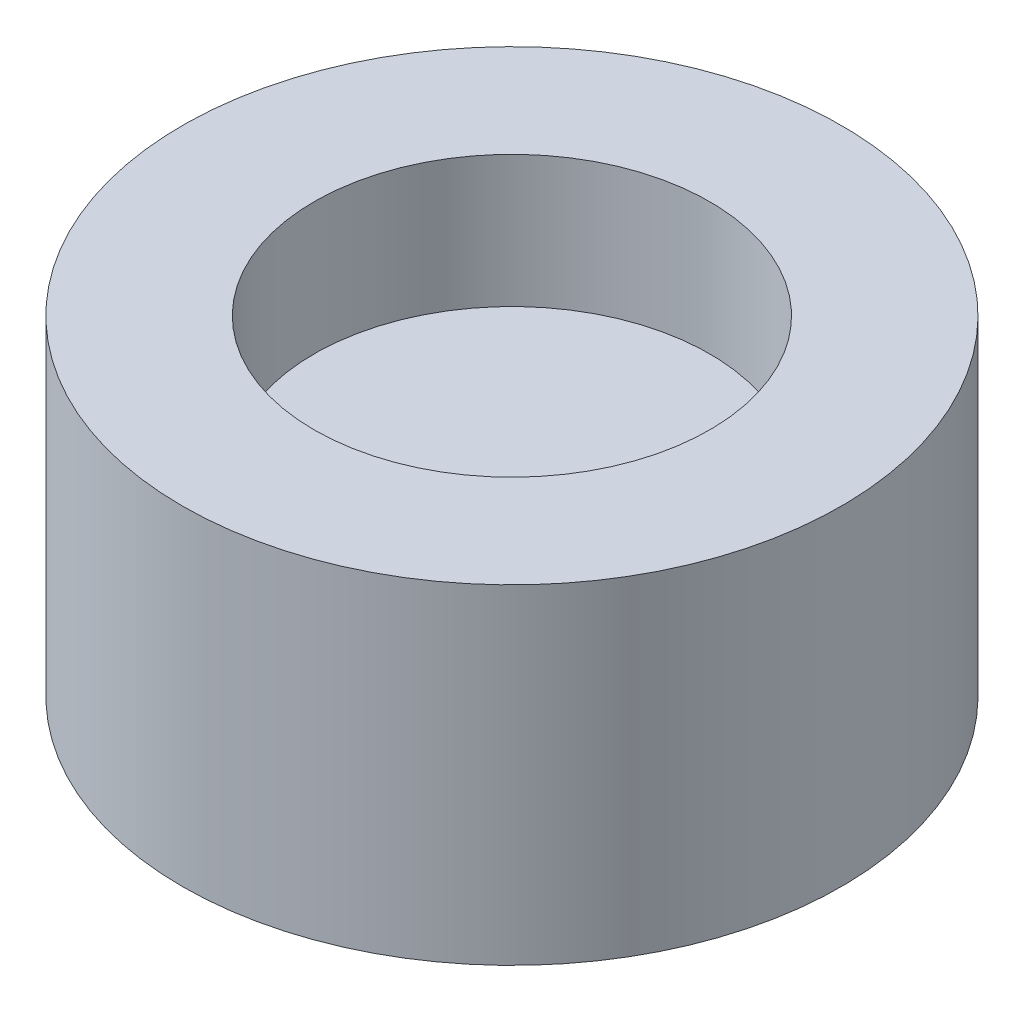
ISO-10303-21;
HEADER;
FILE_DESCRIPTION(('STEP AP214'),'2;1');
FILE_NAME('part.step','',(''),(''),'','','');
FILE_SCHEMA(('AUTOMOTIVE_DESIGN { 1 0 10303 214 1 1 1 1 }'));
ENDSEC;
DATA;
#1=APPLICATION_CONTEXT('core data for automotive mechanical design processes');
#2=APPLICATION_PROTOCOL_DEFINITION('international standard','automotive_design',2000,#1);
#3=PRODUCT_CONTEXT('',#1,'mechanical');
#4=PRODUCT('Part','Part','',(#3));
#5=PRODUCT_RELATED_PRODUCT_CATEGORY('part','',(#4));
#6=PRODUCT_DEFINITION_FORMATION('','',#4);
#7=PRODUCT_DEFINITION_CONTEXT('part definition',#1,'design');
#8=PRODUCT_DEFINITION('design','',#6,#7);
#9=PRODUCT_DEFINITION_SHAPE('','',#8);
#10=(LENGTH_UNIT() NAMED_UNIT(*) SI_UNIT(.MILLI.,.METRE.));
#11=(NAMED_UNIT(*) PLANE_ANGLE_UNIT() SI_UNIT($,.RADIAN.));
#12=(NAMED_UNIT(*) SI_UNIT($,.STERADIAN.) SOLID_ANGLE_UNIT());
#13=UNCERTAINTY_MEASURE_WITH_UNIT(LENGTH_MEASURE(1.E-05),#10,'distance_accuracy_value','');
#14=(GEOMETRIC_REPRESENTATION_CONTEXT(3) GLOBAL_UNCERTAINTY_ASSIGNED_CONTEXT((#13)) GLOBAL_UNIT_ASSIGNED_CONTEXT((#10,
#11,#12)) REPRESENTATION_CONTEXT('',''));
#15=CARTESIAN_POINT('',(0.,0.,0.));
#16=DIRECTION('',(0.,0.,1.));
#17=DIRECTION('',(1.,0.,0.));
#18=AXIS2_PLACEMENT_3D('',#15,#16,#17);
#19=CARTESIAN_POINT('',(0.,2.5,0.));
#20=DIRECTION('',(0.,-1.,0.));
#21=DIRECTION('',(0.,0.,-1.));
#22=AXIS2_PLACEMENT_3D('',#19,#20,#21);
#23=CYLINDRICAL_SURFACE('',#22,2.5);
#24=CARTESIAN_POINT('',(0.,2.5,0.));
#25=DIRECTION('',(0.,1.,0.));
#26=DIRECTION('',(0.,0.,1.));
#27=AXIS2_PLACEMENT_3D('',#24,#25,#26);
#28=CIRCLE('',#27,2.5);
#29=CARTESIAN_POINT('',(0.,2.5,2.5));
#30=VERTEX_POINT('',#29);
#31=EDGE_CURVE('E10',#30,#30,#28,.T.);
#32=ORIENTED_EDGE('',*,*,#31,.F.);
#33=EDGE_LOOP('',(#32));
#34=FACE_BOUND('',#33,.T.);
#35=CARTESIAN_POINT('',(0.,0.,0.));
#36=DIRECTION('',(0.,1.,0.));
#37=DIRECTION('',(0.,0.,1.));
#38=AXIS2_PLACEMENT_3D('',#35,#36,#37);
#39=CIRCLE('',#38,2.5);
#40=CARTESIAN_POINT('',(0.,0.,2.5));
#41=VERTEX_POINT('',#40);
#42=EDGE_CURVE('E46',#41,#41,#39,.T.);
#43=ORIENTED_EDGE('',*,*,#42,.T.);
#44=EDGE_LOOP('',(#43));
#45=FACE_BOUND('',#44,.T.);
#46=ADVANCED_FACE('F43',(#34,#45),#23,.T.);
#47=CARTESIAN_POINT('',(0.,2.5,0.));
#48=DIRECTION('',(0.,1.,0.));
#49=DIRECTION('',(0.,0.,1.));
#50=AXIS2_PLACEMENT_3D('',#47,#48,#49);
#51=PLANE('',#50);
#52=CARTESIAN_POINT('',(0.,2.5,0.));
#53=DIRECTION('',(0.,1.,0.));
#54=DIRECTION('',(0.,0.,1.));
#55=AXIS2_PLACEMENT_3D('',#52,#53,#54);
#56=CIRCLE('',#55,1.5);
#57=CARTESIAN_POINT('',(0.,2.5,1.5));
#58=VERTEX_POINT('',#57);
#59=EDGE_CURVE('E57',#58,#58,#56,.T.);
#60=ORIENTED_EDGE('',*,*,#59,.F.);
#61=EDGE_LOOP('',(#60));
#62=FACE_BOUND('',#61,.T.);
#63=ORIENTED_EDGE('',*,*,#31,.T.);
#64=EDGE_LOOP('',(#63));
#65=FACE_BOUND('',#64,.T.);
#66=ADVANCED_FACE('F74',(#62,#65),#51,.T.);
#67=CARTESIAN_POINT('',(0.,0.,0.));
#68=DIRECTION('',(0.,1.,0.));
#69=DIRECTION('',(0.,0.,1.));
#70=AXIS2_PLACEMENT_3D('',#67,#68,#69);
#71=PLANE('',#70);
#72=ORIENTED_EDGE('',*,*,#42,.F.);
#73=EDGE_LOOP('',(#72));
#74=FACE_BOUND('',#73,.T.);
#75=ADVANCED_FACE('F70',(#74),#71,.F.);
#76=CARTESIAN_POINT('',(0.,1.5,0.));
#77=DIRECTION('',(0.,1.,0.));
#78=DIRECTION('',(0.,0.,1.));
#79=AXIS2_PLACEMENT_3D('',#76,#77,#78);
#80=CYLINDRICAL_SURFACE('',#79,1.5);
#81=CARTESIAN_POINT('',(0.,1.5,0.));
#82=DIRECTION('',(0.,1.,0.));
#83=DIRECTION('',(0.,0.,1.));
#84=AXIS2_PLACEMENT_3D('',#81,#82,#83);
#85=CIRCLE('',#84,1.5);
#86=CARTESIAN_POINT('',(0.,1.5,1.5));
#87=VERTEX_POINT('',#86);
#88=EDGE_CURVE('E55',#87,#87,#85,.T.);
#89=ORIENTED_EDGE('',*,*,#88,.F.);
#90=EDGE_LOOP('',(#89));
#91=FACE_BOUND('',#90,.T.);
#92=ORIENTED_EDGE('',*,*,#59,.T.);
#93=EDGE_LOOP('',(#92));
#94=FACE_BOUND('',#93,.T.);
#95=ADVANCED_FACE('F67',(#91,#94),#80,.F.);
#96=CARTESIAN_POINT('',(0.,1.5,0.));
#97=DIRECTION('',(0.,1.,0.));
#98=DIRECTION('',(0.,0.,1.));
#99=AXIS2_PLACEMENT_3D('',#96,#97,#98);
#100=PLANE('',#99);
#101=ORIENTED_EDGE('',*,*,#88,.T.);
#102=EDGE_LOOP('',(#101));
#103=FACE_BOUND('',#102,.T.);
#104=ADVANCED_FACE('F65',(#103),#100,.T.);
#105=CLOSED_SHELL('',(#46,#66,#75,#95,#104));
#106=MANIFOLD_SOLID_BREP('B2',#105);
#107=ADVANCED_BREP_SHAPE_REPRESENTATION('',(#18,#106),#14);
#108=SHAPE_DEFINITION_REPRESENTATION(#9,#107);
ENDSEC;
END-ISO-10303-21;
